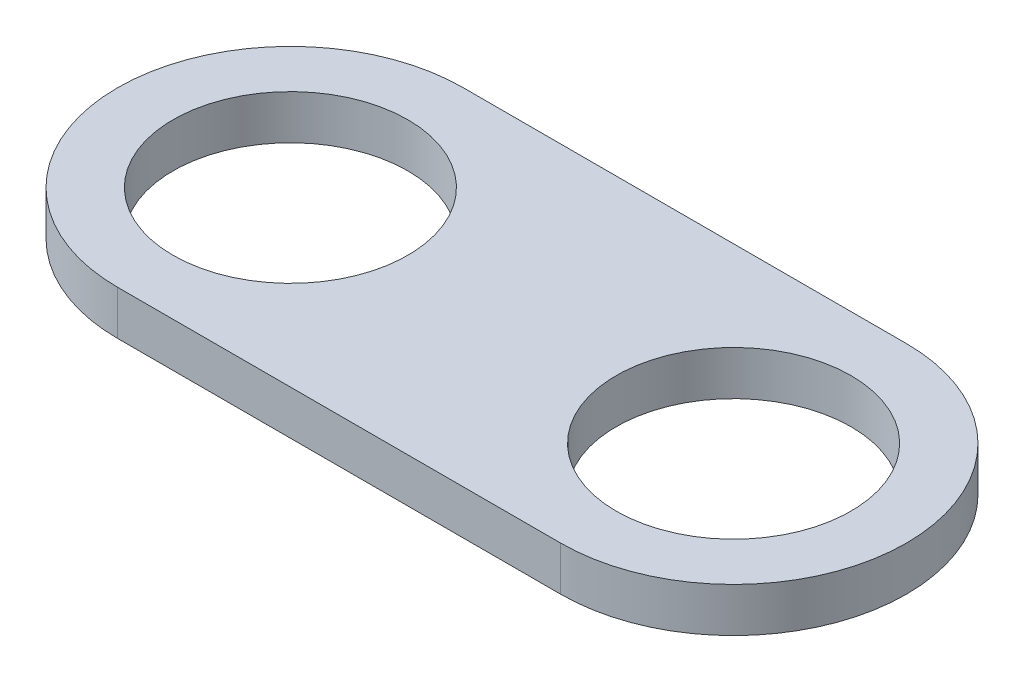
ISO-10303-21;
HEADER;
FILE_DESCRIPTION(('STEP AP214'),'2;1');
FILE_NAME('part.step','',(''),(''),'','','');
FILE_SCHEMA(('AUTOMOTIVE_DESIGN { 1 0 10303 214 1 1 1 1 }'));
ENDSEC;
DATA;
#1=APPLICATION_CONTEXT('core data for automotive mechanical design processes');
#2=APPLICATION_PROTOCOL_DEFINITION('international standard','automotive_design',2000,#1);
#3=PRODUCT_CONTEXT('',#1,'mechanical');
#4=PRODUCT('Part','Part','',(#3));
#5=PRODUCT_RELATED_PRODUCT_CATEGORY('part','',(#4));
#6=PRODUCT_DEFINITION_FORMATION('','',#4);
#7=PRODUCT_DEFINITION_CONTEXT('part definition',#1,'design');
#8=PRODUCT_DEFINITION('design','',#6,#7);
#9=PRODUCT_DEFINITION_SHAPE('','',#8);
#10=(LENGTH_UNIT() NAMED_UNIT(*) SI_UNIT(.MILLI.,.METRE.));
#11=(NAMED_UNIT(*) PLANE_ANGLE_UNIT() SI_UNIT($,.RADIAN.));
#12=(NAMED_UNIT(*) SI_UNIT($,.STERADIAN.) SOLID_ANGLE_UNIT());
#13=UNCERTAINTY_MEASURE_WITH_UNIT(LENGTH_MEASURE(1.E-05),#10,'distance_accuracy_value','');
#14=(GEOMETRIC_REPRESENTATION_CONTEXT(3) GLOBAL_UNCERTAINTY_ASSIGNED_CONTEXT((#13)) GLOBAL_UNIT_ASSIGNED_CONTEXT((#10,
#11,#12)) REPRESENTATION_CONTEXT('',''));
#15=CARTESIAN_POINT('',(0.,0.,0.));
#16=DIRECTION('',(0.,0.,1.));
#17=DIRECTION('',(1.,0.,0.));
#18=AXIS2_PLACEMENT_3D('',#15,#16,#17);
#19=CARTESIAN_POINT('',(-10.,2.,0.));
#20=DIRECTION('',(0.,1.,0.));
#21=DIRECTION('',(0.,0.,1.));
#22=AXIS2_PLACEMENT_3D('',#19,#20,#21);
#23=PLANE('',#22);
#24=CARTESIAN_POINT('',(-10.,2.,0.));
#25=DIRECTION('',(0.,1.,0.));
#26=DIRECTION('',(0.,0.,1.));
#27=AXIS2_PLACEMENT_3D('',#24,#25,#26);
#28=CIRCLE('',#27,5.3);
#29=CARTESIAN_POINT('',(-10.,2.,5.3));
#30=VERTEX_POINT('',#29);
#31=EDGE_CURVE('E100',#30,#30,#28,.T.);
#32=ORIENTED_EDGE('',*,*,#31,.F.);
#33=EDGE_LOOP('',(#32));
#34=FACE_BOUND('',#33,.T.);
#35=CARTESIAN_POINT('',(-10.,2.,0.));
#36=DIRECTION('',(0.,1.,0.));
#37=DIRECTION('',(0.,0.,1.));
#38=AXIS2_PLACEMENT_3D('',#35,#36,#37);
#39=CIRCLE('',#38,7.79999999999999);
#40=CARTESIAN_POINT('',(-10.,2.,-7.79999999999999));
#41=VERTEX_POINT('',#40);
#42=CARTESIAN_POINT('',(-10.,2.,7.79999999999999));
#43=VERTEX_POINT('',#42);
#44=EDGE_CURVE('E85',#41,#43,#39,.T.);
#45=ORIENTED_EDGE('',*,*,#44,.T.);
#46=DIRECTION('',(1.,0.,0.));
#47=VECTOR('',#46,1.);
#48=CARTESIAN_POINT('',(-10.,2.,7.79999999999999));
#49=LINE('',#48,#47);
#50=CARTESIAN_POINT('',(10.,2.,7.79999999999999));
#51=VERTEX_POINT('',#50);
#52=EDGE_CURVE('E80',#43,#51,#49,.T.);
#53=ORIENTED_EDGE('',*,*,#52,.T.);
#54=CARTESIAN_POINT('',(10.,2.,0.));
#55=DIRECTION('',(0.,1.,0.));
#56=DIRECTION('',(0.,0.,1.));
#57=AXIS2_PLACEMENT_3D('',#54,#55,#56);
#58=CIRCLE('',#57,7.79999999999999);
#59=CARTESIAN_POINT('',(9.99999999999999,2.,-7.8));
#60=VERTEX_POINT('',#59);
#61=EDGE_CURVE('E83',#51,#60,#58,.T.);
#62=ORIENTED_EDGE('',*,*,#61,.T.);
#63=DIRECTION('',(-1.,0.,0.));
#64=VECTOR('',#63,1.);
#65=CARTESIAN_POINT('',(-10.,2.,-7.79999999999999));
#66=LINE('',#65,#64);
#67=EDGE_CURVE('E50',#60,#41,#66,.T.);
#68=ORIENTED_EDGE('',*,*,#67,.T.);
#69=EDGE_LOOP('',(#45,#53,#62,#68));
#70=FACE_BOUND('',#69,.T.);
#71=CARTESIAN_POINT('',(10.,2.,0.));
#72=DIRECTION('',(0.,1.,0.));
#73=DIRECTION('',(0.,0.,1.));
#74=AXIS2_PLACEMENT_3D('',#71,#72,#73);
#75=CIRCLE('',#74,5.3);
#76=CARTESIAN_POINT('',(10.,2.,5.3));
#77=VERTEX_POINT('',#76);
#78=EDGE_CURVE('E115',#77,#77,#75,.T.);
#79=ORIENTED_EDGE('',*,*,#78,.F.);
#80=EDGE_LOOP('',(#79));
#81=FACE_BOUND('',#80,.T.);
#82=ADVANCED_FACE('F33',(#34,#70,#81),#23,.T.);
#83=CARTESIAN_POINT('',(-10.,0.,0.));
#84=DIRECTION('',(0.,1.,0.));
#85=DIRECTION('',(0.,0.,1.));
#86=AXIS2_PLACEMENT_3D('',#83,#84,#85);
#87=PLANE('',#86);
#88=CARTESIAN_POINT('',(-10.,0.,0.));
#89=DIRECTION('',(0.,1.,0.));
#90=DIRECTION('',(0.,0.,1.));
#91=AXIS2_PLACEMENT_3D('',#88,#89,#90);
#92=CIRCLE('',#91,7.79999999999999);
#93=CARTESIAN_POINT('',(-10.,0.,-7.79999999999999));
#94=VERTEX_POINT('',#93);
#95=CARTESIAN_POINT('',(-10.,0.,7.79999999999999));
#96=VERTEX_POINT('',#95);
#97=EDGE_CURVE('E97',#94,#96,#92,.T.);
#98=ORIENTED_EDGE('',*,*,#97,.F.);
#99=DIRECTION('',(-1.,0.,0.));
#100=VECTOR('',#99,1.);
#101=CARTESIAN_POINT('',(-10.,0.,-7.79999999999999));
#102=LINE('',#101,#100);
#103=CARTESIAN_POINT('',(9.99999999999999,0.,-7.8));
#104=VERTEX_POINT('',#103);
#105=EDGE_CURVE('E73',#104,#94,#102,.T.);
#106=ORIENTED_EDGE('',*,*,#105,.F.);
#107=CARTESIAN_POINT('',(10.,0.,0.));
#108=DIRECTION('',(0.,1.,0.));
#109=DIRECTION('',(0.,0.,1.));
#110=AXIS2_PLACEMENT_3D('',#107,#108,#109);
#111=CIRCLE('',#110,7.79999999999999);
#112=CARTESIAN_POINT('',(10.,0.,7.79999999999999));
#113=VERTEX_POINT('',#112);
#114=EDGE_CURVE('E67',#113,#104,#111,.T.);
#115=ORIENTED_EDGE('',*,*,#114,.F.);
#116=DIRECTION('',(1.,0.,0.));
#117=VECTOR('',#116,1.);
#118=CARTESIAN_POINT('',(-10.,0.,7.79999999999999));
#119=LINE('',#118,#117);
#120=EDGE_CURVE('E89',#96,#113,#119,.T.);
#121=ORIENTED_EDGE('',*,*,#120,.F.);
#122=EDGE_LOOP('',(#98,#106,#115,#121));
#123=FACE_BOUND('',#122,.T.);
#124=CARTESIAN_POINT('',(-10.,0.,0.));
#125=DIRECTION('',(0.,1.,0.));
#126=DIRECTION('',(0.,0.,1.));
#127=AXIS2_PLACEMENT_3D('',#124,#125,#126);
#128=CIRCLE('',#127,5.3);
#129=CARTESIAN_POINT('',(-10.,0.,5.3));
#130=VERTEX_POINT('',#129);
#131=EDGE_CURVE('E112',#130,#130,#128,.T.);
#132=ORIENTED_EDGE('',*,*,#131,.T.);
#133=EDGE_LOOP('',(#132));
#134=FACE_BOUND('',#133,.T.);
#135=CARTESIAN_POINT('',(10.,0.,0.));
#136=DIRECTION('',(0.,1.,0.));
#137=DIRECTION('',(0.,0.,1.));
#138=AXIS2_PLACEMENT_3D('',#135,#136,#137);
#139=CIRCLE('',#138,5.3);
#140=CARTESIAN_POINT('',(10.,0.,5.3));
#141=VERTEX_POINT('',#140);
#142=EDGE_CURVE('E118',#141,#141,#139,.T.);
#143=ORIENTED_EDGE('',*,*,#142,.T.);
#144=EDGE_LOOP('',(#143));
#145=FACE_BOUND('',#144,.T.);
#146=ADVANCED_FACE('F108',(#123,#134,#145),#87,.F.);
#147=CARTESIAN_POINT('',(-10.,2.,0.));
#148=DIRECTION('',(0.,-1.,0.));
#149=DIRECTION('',(0.,0.,-1.));
#150=AXIS2_PLACEMENT_3D('',#147,#148,#149);
#151=CYLINDRICAL_SURFACE('',#150,7.79999999999999);
#152=ORIENTED_EDGE('',*,*,#97,.T.);
#153=DIRECTION('',(0.,-1.,0.));
#154=VECTOR('',#153,1.);
#155=CARTESIAN_POINT('',(-10.,2.,7.79999999999999));
#156=LINE('',#155,#154);
#157=EDGE_CURVE('E11',#43,#96,#156,.T.);
#158=ORIENTED_EDGE('',*,*,#157,.F.);
#159=ORIENTED_EDGE('',*,*,#44,.F.);
#160=DIRECTION('',(0.,-1.,0.));
#161=VECTOR('',#160,1.);
#162=CARTESIAN_POINT('',(-10.,2.,-7.79999999999999));
#163=LINE('',#162,#161);
#164=EDGE_CURVE('E93',#41,#94,#163,.T.);
#165=ORIENTED_EDGE('',*,*,#164,.T.);
#166=EDGE_LOOP('',(#152,#158,#159,#165));
#167=FACE_BOUND('',#166,.T.);
#168=ADVANCED_FACE('F35',(#167),#151,.T.);
#169=CARTESIAN_POINT('',(-10.,2.,7.79999999999999));
#170=DIRECTION('',(0.,0.,-1.));
#171=DIRECTION('',(-1.,0.,0.));
#172=AXIS2_PLACEMENT_3D('',#169,#170,#171);
#173=PLANE('',#172);
#174=ORIENTED_EDGE('',*,*,#120,.T.);
#175=DIRECTION('',(0.,-1.,0.));
#176=VECTOR('',#175,1.);
#177=CARTESIAN_POINT('',(10.,2.,7.79999999999999));
#178=LINE('',#177,#176);
#179=EDGE_CURVE('E42',#51,#113,#178,.T.);
#180=ORIENTED_EDGE('',*,*,#179,.F.);
#181=ORIENTED_EDGE('',*,*,#52,.F.);
#182=ORIENTED_EDGE('',*,*,#157,.T.);
#183=EDGE_LOOP('',(#174,#180,#181,#182));
#184=FACE_BOUND('',#183,.T.);
#185=ADVANCED_FACE('F88',(#184),#173,.F.);
#186=CARTESIAN_POINT('',(10.,2.,0.));
#187=DIRECTION('',(0.,-1.,0.));
#188=DIRECTION('',(0.,0.,-1.));
#189=AXIS2_PLACEMENT_3D('',#186,#187,#188);
#190=CYLINDRICAL_SURFACE('',#189,7.79999999999999);
#191=ORIENTED_EDGE('',*,*,#114,.T.);
#192=DIRECTION('',(0.,-1.,0.));
#193=VECTOR('',#192,1.);
#194=CARTESIAN_POINT('',(9.99999999999999,2.,-7.8));
#195=LINE('',#194,#193);
#196=EDGE_CURVE('E90',#60,#104,#195,.T.);
#197=ORIENTED_EDGE('',*,*,#196,.F.);
#198=ORIENTED_EDGE('',*,*,#61,.F.);
#199=ORIENTED_EDGE('',*,*,#179,.T.);
#200=EDGE_LOOP('',(#191,#197,#198,#199));
#201=FACE_BOUND('',#200,.T.);
#202=ADVANCED_FACE('F91',(#201),#190,.T.);
#203=CARTESIAN_POINT('',(-10.,2.,-7.79999999999999));
#204=DIRECTION('',(0.,0.,1.));
#205=DIRECTION('',(1.,0.,0.));
#206=AXIS2_PLACEMENT_3D('',#203,#204,#205);
#207=PLANE('',#206);
#208=ORIENTED_EDGE('',*,*,#105,.T.);
#209=ORIENTED_EDGE('',*,*,#164,.F.);
#210=ORIENTED_EDGE('',*,*,#67,.F.);
#211=ORIENTED_EDGE('',*,*,#196,.T.);
#212=EDGE_LOOP('',(#208,#209,#210,#211));
#213=FACE_BOUND('',#212,.T.);
#214=ADVANCED_FACE('F105',(#213),#207,.F.);
#215=CARTESIAN_POINT('',(-10.,2.,0.));
#216=DIRECTION('',(0.,-1.,0.));
#217=DIRECTION('',(0.,0.,-1.));
#218=AXIS2_PLACEMENT_3D('',#215,#216,#217);
#219=CYLINDRICAL_SURFACE('',#218,5.3);
#220=ORIENTED_EDGE('',*,*,#31,.T.);
#221=EDGE_LOOP('',(#220));
#222=FACE_BOUND('',#221,.T.);
#223=ORIENTED_EDGE('',*,*,#131,.F.);
#224=EDGE_LOOP('',(#223));
#225=FACE_BOUND('',#224,.T.);
#226=ADVANCED_FACE('F135',(#222,#225),#219,.F.);
#227=CARTESIAN_POINT('',(10.,2.,0.));
#228=DIRECTION('',(0.,-1.,0.));
#229=DIRECTION('',(0.,0.,-1.));
#230=AXIS2_PLACEMENT_3D('',#227,#228,#229);
#231=CYLINDRICAL_SURFACE('',#230,5.3);
#232=ORIENTED_EDGE('',*,*,#78,.T.);
#233=EDGE_LOOP('',(#232));
#234=FACE_BOUND('',#233,.T.);
#235=ORIENTED_EDGE('',*,*,#142,.F.);
#236=EDGE_LOOP('',(#235));
#237=FACE_BOUND('',#236,.T.);
#238=ADVANCED_FACE('F124',(#234,#237),#231,.F.);
#239=CLOSED_SHELL('',(#82,#146,#168,#185,#202,#214,#226,#238));
#240=MANIFOLD_SOLID_BREP('B2',#239);
#241=ADVANCED_BREP_SHAPE_REPRESENTATION('',(#18,#240),#14);
#242=SHAPE_DEFINITION_REPRESENTATION(#9,#241);
ENDSEC;
END-ISO-10303-21;
